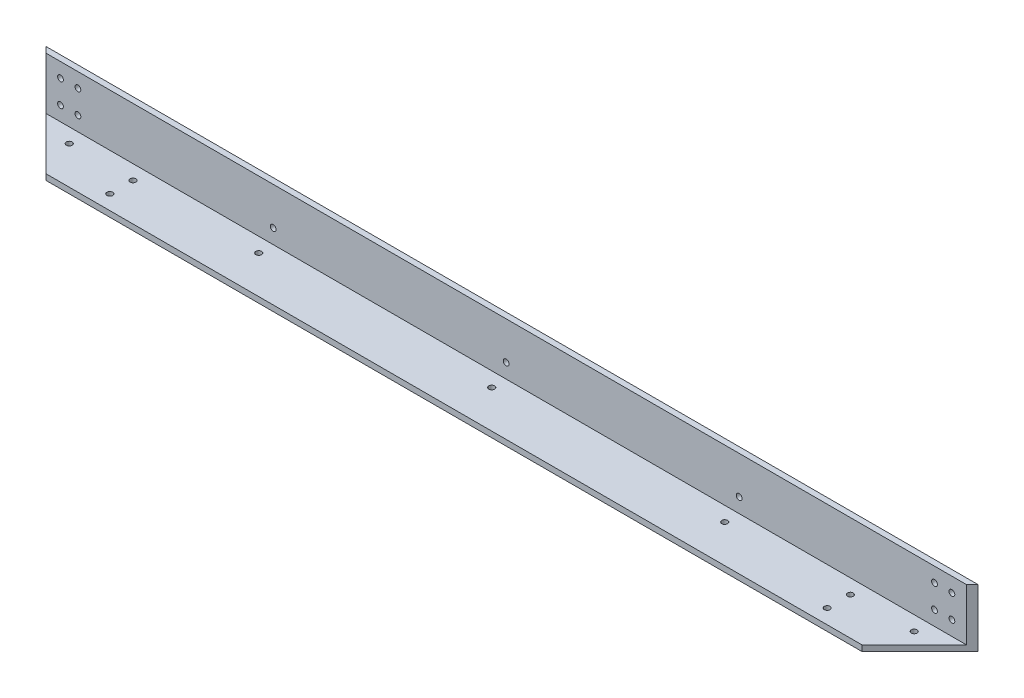
ISO-10303-21;
HEADER;
FILE_DESCRIPTION(('STEP AP214'),'2;1');
FILE_NAME('part.step','',(''),(''),'','','');
FILE_SCHEMA(('AUTOMOTIVE_DESIGN { 1 0 10303 214 1 1 1 1 }'));
ENDSEC;
DATA;
#1=APPLICATION_CONTEXT('core data for automotive mechanical design processes');
#2=APPLICATION_PROTOCOL_DEFINITION('international standard','automotive_design',2000,#1);
#3=PRODUCT_CONTEXT('',#1,'mechanical');
#4=PRODUCT('Part','Part','',(#3));
#5=PRODUCT_RELATED_PRODUCT_CATEGORY('part','',(#4));
#6=PRODUCT_DEFINITION_FORMATION('','',#4);
#7=PRODUCT_DEFINITION_CONTEXT('part definition',#1,'design');
#8=PRODUCT_DEFINITION('design','',#6,#7);
#9=PRODUCT_DEFINITION_SHAPE('','',#8);
#10=(LENGTH_UNIT() NAMED_UNIT(*) SI_UNIT(.MILLI.,.METRE.));
#11=(NAMED_UNIT(*) PLANE_ANGLE_UNIT() SI_UNIT($,.RADIAN.));
#12=(NAMED_UNIT(*) SI_UNIT($,.STERADIAN.) SOLID_ANGLE_UNIT());
#13=UNCERTAINTY_MEASURE_WITH_UNIT(LENGTH_MEASURE(1.E-05),#10,'distance_accuracy_value','');
#14=(GEOMETRIC_REPRESENTATION_CONTEXT(3) GLOBAL_UNCERTAINTY_ASSIGNED_CONTEXT((#13)) GLOBAL_UNIT_ASSIGNED_CONTEXT((#10,
#11,#12)) REPRESENTATION_CONTEXT('',''));
#15=CARTESIAN_POINT('',(0.,0.,0.));
#16=DIRECTION('',(0.,0.,1.));
#17=DIRECTION('',(1.,0.,0.));
#18=AXIS2_PLACEMENT_3D('',#15,#16,#17);
#19=CARTESIAN_POINT('',(510.,31.75,0.));
#20=DIRECTION('',(0.,0.,1.));
#21=DIRECTION('',(0.,-1.,0.));
#22=AXIS2_PLACEMENT_3D('',#19,#20,#21);
#23=PLANE('',#22);
#24=CARTESIAN_POINT('',(20.6375,11.1125,0.));
#25=DIRECTION('',(0.,0.,1.));
#26=DIRECTION('',(1.,0.,0.));
#27=AXIS2_PLACEMENT_3D('',#24,#25,#26);
#28=CIRCLE('',#27,1.5875);
#29=CARTESIAN_POINT('',(22.225,11.1125,0.));
#30=VERTEX_POINT('',#29);
#31=EDGE_CURVE('E307',#30,#30,#28,.T.);
#32=ORIENTED_EDGE('',*,*,#31,.T.);
#33=EDGE_LOOP('',(#32));
#34=FACE_BOUND('',#33,.T.);
#35=CARTESIAN_POINT('',(489.3625,11.1125,0.));
#36=DIRECTION('',(0.,0.,1.));
#37=DIRECTION('',(1.,0.,0.));
#38=AXIS2_PLACEMENT_3D('',#35,#36,#37);
#39=CIRCLE('',#38,1.58750000000004);
#40=CARTESIAN_POINT('',(490.95,11.1125,0.));
#41=VERTEX_POINT('',#40);
#42=EDGE_CURVE('E297',#41,#41,#39,.T.);
#43=ORIENTED_EDGE('',*,*,#42,.T.);
#44=EDGE_LOOP('',(#43));
#45=FACE_BOUND('',#44,.T.);
#46=CARTESIAN_POINT('',(498.8875,11.1125,0.));
#47=DIRECTION('',(0.,0.,1.));
#48=DIRECTION('',(1.,0.,0.));
#49=AXIS2_PLACEMENT_3D('',#46,#47,#48);
#50=CIRCLE('',#49,1.58749999999999);
#51=CARTESIAN_POINT('',(500.475,11.1125,0.));
#52=VERTEX_POINT('',#51);
#53=EDGE_CURVE('E298',#52,#52,#50,.T.);
#54=ORIENTED_EDGE('',*,*,#53,.T.);
#55=EDGE_LOOP('',(#54));
#56=FACE_BOUND('',#55,.T.);
#57=CARTESIAN_POINT('',(127.5,11.1125,0.));
#58=DIRECTION('',(0.,0.,1.));
#59=DIRECTION('',(1.,0.,0.));
#60=AXIS2_PLACEMENT_3D('',#57,#58,#59);
#61=CIRCLE('',#60,1.58749999999998);
#62=CARTESIAN_POINT('',(129.0875,11.1125,0.));
#63=VERTEX_POINT('',#62);
#64=EDGE_CURVE('E281',#63,#63,#61,.T.);
#65=ORIENTED_EDGE('',*,*,#64,.T.);
#66=EDGE_LOOP('',(#65));
#67=FACE_BOUND('',#66,.T.);
#68=CARTESIAN_POINT('',(11.1125,11.1125,0.));
#69=DIRECTION('',(0.,0.,1.));
#70=DIRECTION('',(1.,0.,0.));
#71=AXIS2_PLACEMENT_3D('',#68,#69,#70);
#72=CIRCLE('',#71,1.5875);
#73=CARTESIAN_POINT('',(12.7,11.1125,0.));
#74=VERTEX_POINT('',#73);
#75=EDGE_CURVE('E306',#74,#74,#72,.T.);
#76=ORIENTED_EDGE('',*,*,#75,.T.);
#77=EDGE_LOOP('',(#76));
#78=FACE_BOUND('',#77,.T.);
#79=CARTESIAN_POINT('',(20.6375,23.8125,0.));
#80=DIRECTION('',(0.,0.,1.));
#81=DIRECTION('',(1.,0.,0.));
#82=AXIS2_PLACEMENT_3D('',#79,#80,#81);
#83=CIRCLE('',#82,1.5875);
#84=CARTESIAN_POINT('',(22.225,23.8125,0.));
#85=VERTEX_POINT('',#84);
#86=EDGE_CURVE('E330',#85,#85,#83,.T.);
#87=ORIENTED_EDGE('',*,*,#86,.T.);
#88=EDGE_LOOP('',(#87));
#89=FACE_BOUND('',#88,.T.);
#90=CARTESIAN_POINT('',(489.3625,23.8125,0.));
#91=DIRECTION('',(0.,0.,1.));
#92=DIRECTION('',(1.,0.,0.));
#93=AXIS2_PLACEMENT_3D('',#90,#91,#92);
#94=CIRCLE('',#93,1.58750000000004);
#95=CARTESIAN_POINT('',(490.95,23.8125,0.));
#96=VERTEX_POINT('',#95);
#97=EDGE_CURVE('E324',#96,#96,#94,.T.);
#98=ORIENTED_EDGE('',*,*,#97,.T.);
#99=EDGE_LOOP('',(#98));
#100=FACE_BOUND('',#99,.T.);
#101=CARTESIAN_POINT('',(498.8875,23.8125,0.));
#102=DIRECTION('',(0.,0.,1.));
#103=DIRECTION('',(1.,0.,0.));
#104=AXIS2_PLACEMENT_3D('',#101,#102,#103);
#105=CIRCLE('',#104,1.58749999999999);
#106=CARTESIAN_POINT('',(500.475,23.8125,0.));
#107=VERTEX_POINT('',#106);
#108=EDGE_CURVE('E318',#107,#107,#105,.T.);
#109=ORIENTED_EDGE('',*,*,#108,.T.);
#110=EDGE_LOOP('',(#109));
#111=FACE_BOUND('',#110,.T.);
#112=CARTESIAN_POINT('',(255.,11.1125,0.));
#113=DIRECTION('',(0.,0.,1.));
#114=DIRECTION('',(1.,0.,0.));
#115=AXIS2_PLACEMENT_3D('',#112,#113,#114);
#116=CIRCLE('',#115,1.58750000000004);
#117=CARTESIAN_POINT('',(256.5875,11.1125,0.));
#118=VERTEX_POINT('',#117);
#119=EDGE_CURVE('E276',#118,#118,#116,.T.);
#120=ORIENTED_EDGE('',*,*,#119,.T.);
#121=EDGE_LOOP('',(#120));
#122=FACE_BOUND('',#121,.T.);
#123=CARTESIAN_POINT('',(382.5,11.1125,0.));
#124=DIRECTION('',(0.,0.,1.));
#125=DIRECTION('',(1.,0.,0.));
#126=AXIS2_PLACEMENT_3D('',#123,#124,#125);
#127=CIRCLE('',#126,1.58750000000004);
#128=CARTESIAN_POINT('',(384.0875,11.1125,0.));
#129=VERTEX_POINT('',#128);
#130=EDGE_CURVE('E291',#129,#129,#127,.T.);
#131=ORIENTED_EDGE('',*,*,#130,.T.);
#132=EDGE_LOOP('',(#131));
#133=FACE_BOUND('',#132,.T.);
#134=CARTESIAN_POINT('',(11.1125,23.8125,0.));
#135=DIRECTION('',(0.,0.,1.));
#136=DIRECTION('',(1.,0.,0.));
#137=AXIS2_PLACEMENT_3D('',#134,#135,#136);
#138=CIRCLE('',#137,1.5875);
#139=CARTESIAN_POINT('',(12.7,23.8125,0.));
#140=VERTEX_POINT('',#139);
#141=EDGE_CURVE('E338',#140,#140,#138,.T.);
#142=ORIENTED_EDGE('',*,*,#141,.T.);
#143=EDGE_LOOP('',(#142));
#144=FACE_BOUND('',#143,.T.);
#145=DIRECTION('',(0.,1.,0.));
#146=VECTOR('',#145,1.);
#147=CARTESIAN_POINT('',(0.,31.75,0.));
#148=LINE('',#147,#146);
#149=CARTESIAN_POINT('',(0.,0.,0.));
#150=VERTEX_POINT('',#149);
#151=CARTESIAN_POINT('',(0.,31.75,0.));
#152=VERTEX_POINT('',#151);
#153=EDGE_CURVE('E109',#150,#152,#148,.T.);
#154=ORIENTED_EDGE('',*,*,#153,.T.);
#155=DIRECTION('',(-1.,0.,0.));
#156=VECTOR('',#155,1.);
#157=CARTESIAN_POINT('',(510.,31.75,0.));
#158=LINE('',#157,#156);
#159=CARTESIAN_POINT('',(510.,31.75,0.));
#160=VERTEX_POINT('',#159);
#161=EDGE_CURVE('E95',#160,#152,#158,.T.);
#162=ORIENTED_EDGE('',*,*,#161,.F.);
#163=DIRECTION('',(0.,1.,0.));
#164=VECTOR('',#163,1.);
#165=CARTESIAN_POINT('',(510.,31.75,0.));
#166=LINE('',#165,#164);
#167=CARTESIAN_POINT('',(510.,0.,0.));
#168=VERTEX_POINT('',#167);
#169=EDGE_CURVE('E107',#168,#160,#166,.T.);
#170=ORIENTED_EDGE('',*,*,#169,.F.);
#171=DIRECTION('',(-1.,0.,0.));
#172=VECTOR('',#171,1.);
#173=CARTESIAN_POINT('',(510.,0.,0.));
#174=LINE('',#173,#172);
#175=EDGE_CURVE('E116',#168,#150,#174,.T.);
#176=ORIENTED_EDGE('',*,*,#175,.T.);
#177=EDGE_LOOP('',(#154,#162,#170,#176));
#178=FACE_BOUND('',#177,.T.);
#179=ADVANCED_FACE('F40',(#34,#45,#56,#67,#78,#89,#100,#111,#122,#133,#144,#178),#23,.F.);
#180=CARTESIAN_POINT('',(510.,31.75,3.17499999999997));
#181=DIRECTION('',(0.,-1.,0.));
#182=DIRECTION('',(0.,0.,-1.));
#183=AXIS2_PLACEMENT_3D('',#180,#181,#182);
#184=PLANE('',#183);
#185=ORIENTED_EDGE('',*,*,#161,.T.);
#186=DIRECTION('',(0.707106781186546,0.,0.707106781186549));
#187=VECTOR('',#186,1.);
#188=CARTESIAN_POINT('',(31.75,31.75,31.75));
#189=LINE('',#188,#187);
#190=CARTESIAN_POINT('',(3.17500000000004,31.75,3.17499999999997));
#191=VERTEX_POINT('',#190);
#192=EDGE_CURVE('E63',#152,#191,#189,.T.);
#193=ORIENTED_EDGE('',*,*,#192,.T.);
#194=DIRECTION('',(-1.,0.,0.));
#195=VECTOR('',#194,1.);
#196=CARTESIAN_POINT('',(510.,31.75,3.17499999999997));
#197=LINE('',#196,#195);
#198=CARTESIAN_POINT('',(506.825,31.75,3.17499999999997));
#199=VERTEX_POINT('',#198);
#200=EDGE_CURVE('E97',#199,#191,#197,.T.);
#201=ORIENTED_EDGE('',*,*,#200,.F.);
#202=DIRECTION('',(-0.707106781186548,0.,0.707106781186547));
#203=VECTOR('',#202,1.);
#204=CARTESIAN_POINT('',(510.,31.75,0.));
#205=LINE('',#204,#203);
#206=EDGE_CURVE('E92',#199,#160,#205,.F.);
#207=ORIENTED_EDGE('',*,*,#206,.T.);
#208=EDGE_LOOP('',(#185,#193,#201,#207));
#209=FACE_BOUND('',#208,.T.);
#210=ADVANCED_FACE('F94',(#209),#184,.F.);
#211=CARTESIAN_POINT('',(510.,3.17499999999996,3.175));
#212=DIRECTION('',(0.,0.,-1.));
#213=DIRECTION('',(0.,1.,0.));
#214=AXIS2_PLACEMENT_3D('',#211,#212,#213);
#215=PLANE('',#214);
#216=CARTESIAN_POINT('',(20.6375,11.1125,3.17500000000001));
#217=DIRECTION('',(0.,0.,1.));
#218=DIRECTION('',(1.,0.,0.));
#219=AXIS2_PLACEMENT_3D('',#216,#217,#218);
#220=CIRCLE('',#219,1.5875);
#221=CARTESIAN_POINT('',(22.225,11.1125,3.17500000000001));
#222=VERTEX_POINT('',#221);
#223=EDGE_CURVE('E303',#222,#222,#220,.T.);
#224=ORIENTED_EDGE('',*,*,#223,.F.);
#225=EDGE_LOOP('',(#224));
#226=FACE_BOUND('',#225,.T.);
#227=CARTESIAN_POINT('',(489.3625,11.1125,3.17500000000001));
#228=DIRECTION('',(0.,0.,1.));
#229=DIRECTION('',(1.,0.,0.));
#230=AXIS2_PLACEMENT_3D('',#227,#228,#229);
#231=CIRCLE('',#230,1.58750000000004);
#232=CARTESIAN_POINT('',(490.95,11.1125,3.17500000000001));
#233=VERTEX_POINT('',#232);
#234=EDGE_CURVE('E309',#233,#233,#231,.T.);
#235=ORIENTED_EDGE('',*,*,#234,.F.);
#236=EDGE_LOOP('',(#235));
#237=FACE_BOUND('',#236,.T.);
#238=CARTESIAN_POINT('',(498.8875,11.1125,3.17500000000001));
#239=DIRECTION('',(0.,0.,1.));
#240=DIRECTION('',(1.,0.,0.));
#241=AXIS2_PLACEMENT_3D('',#238,#239,#240);
#242=CIRCLE('',#241,1.58749999999999);
#243=CARTESIAN_POINT('',(500.475,11.1125,3.17500000000001));
#244=VERTEX_POINT('',#243);
#245=EDGE_CURVE('E294',#244,#244,#242,.T.);
#246=ORIENTED_EDGE('',*,*,#245,.F.);
#247=EDGE_LOOP('',(#246));
#248=FACE_BOUND('',#247,.T.);
#249=CARTESIAN_POINT('',(127.5,11.1125,3.17500000000001));
#250=DIRECTION('',(0.,0.,1.));
#251=DIRECTION('',(1.,0.,0.));
#252=AXIS2_PLACEMENT_3D('',#249,#250,#251);
#253=CIRCLE('',#252,1.58749999999998);
#254=CARTESIAN_POINT('',(129.0875,11.1125,3.17500000000001));
#255=VERTEX_POINT('',#254);
#256=EDGE_CURVE('E284',#255,#255,#253,.T.);
#257=ORIENTED_EDGE('',*,*,#256,.F.);
#258=EDGE_LOOP('',(#257));
#259=FACE_BOUND('',#258,.T.);
#260=CARTESIAN_POINT('',(11.1125,11.1125,3.17500000000001));
#261=DIRECTION('',(0.,0.,1.));
#262=DIRECTION('',(1.,0.,0.));
#263=AXIS2_PLACEMENT_3D('',#260,#261,#262);
#264=CIRCLE('',#263,1.5875);
#265=CARTESIAN_POINT('',(12.7,11.1125,3.17500000000001));
#266=VERTEX_POINT('',#265);
#267=EDGE_CURVE('E333',#266,#266,#264,.T.);
#268=ORIENTED_EDGE('',*,*,#267,.F.);
#269=EDGE_LOOP('',(#268));
#270=FACE_BOUND('',#269,.T.);
#271=CARTESIAN_POINT('',(20.6375,23.8125,3.17500000000001));
#272=DIRECTION('',(0.,0.,1.));
#273=DIRECTION('',(1.,0.,0.));
#274=AXIS2_PLACEMENT_3D('',#271,#272,#273);
#275=CIRCLE('',#274,1.5875);
#276=CARTESIAN_POINT('',(22.225,23.8125,3.17500000000001));
#277=VERTEX_POINT('',#276);
#278=EDGE_CURVE('E327',#277,#277,#275,.T.);
#279=ORIENTED_EDGE('',*,*,#278,.F.);
#280=EDGE_LOOP('',(#279));
#281=FACE_BOUND('',#280,.T.);
#282=CARTESIAN_POINT('',(489.3625,23.8125,3.17500000000001));
#283=DIRECTION('',(0.,0.,1.));
#284=DIRECTION('',(1.,0.,0.));
#285=AXIS2_PLACEMENT_3D('',#282,#283,#284);
#286=CIRCLE('',#285,1.58750000000004);
#287=CARTESIAN_POINT('',(490.95,23.8125,3.17500000000001));
#288=VERTEX_POINT('',#287);
#289=EDGE_CURVE('E321',#288,#288,#286,.T.);
#290=ORIENTED_EDGE('',*,*,#289,.F.);
#291=EDGE_LOOP('',(#290));
#292=FACE_BOUND('',#291,.T.);
#293=CARTESIAN_POINT('',(498.8875,23.8125,3.17500000000001));
#294=DIRECTION('',(0.,0.,1.));
#295=DIRECTION('',(1.,0.,0.));
#296=AXIS2_PLACEMENT_3D('',#293,#294,#295);
#297=CIRCLE('',#296,1.58749999999999);
#298=CARTESIAN_POINT('',(500.475,23.8125,3.17500000000001));
#299=VERTEX_POINT('',#298);
#300=EDGE_CURVE('E314',#299,#299,#297,.T.);
#301=ORIENTED_EDGE('',*,*,#300,.F.);
#302=EDGE_LOOP('',(#301));
#303=FACE_BOUND('',#302,.T.);
#304=CARTESIAN_POINT('',(255.,11.1125,3.17500000000001));
#305=DIRECTION('',(0.,0.,1.));
#306=DIRECTION('',(1.,0.,0.));
#307=AXIS2_PLACEMENT_3D('',#304,#305,#306);
#308=CIRCLE('',#307,1.58750000000004);
#309=CARTESIAN_POINT('',(256.5875,11.1125,3.17500000000001));
#310=VERTEX_POINT('',#309);
#311=EDGE_CURVE('E279',#310,#310,#308,.T.);
#312=ORIENTED_EDGE('',*,*,#311,.F.);
#313=EDGE_LOOP('',(#312));
#314=FACE_BOUND('',#313,.T.);
#315=CARTESIAN_POINT('',(382.5,11.1125,3.17500000000001));
#316=DIRECTION('',(0.,0.,1.));
#317=DIRECTION('',(1.,0.,0.));
#318=AXIS2_PLACEMENT_3D('',#315,#316,#317);
#319=CIRCLE('',#318,1.58750000000004);
#320=CARTESIAN_POINT('',(384.0875,11.1125,3.17500000000001));
#321=VERTEX_POINT('',#320);
#322=EDGE_CURVE('E286',#321,#321,#319,.T.);
#323=ORIENTED_EDGE('',*,*,#322,.F.);
#324=EDGE_LOOP('',(#323));
#325=FACE_BOUND('',#324,.T.);
#326=CARTESIAN_POINT('',(11.1125,23.8125,3.17500000000001));
#327=DIRECTION('',(0.,0.,1.));
#328=DIRECTION('',(1.,0.,0.));
#329=AXIS2_PLACEMENT_3D('',#326,#327,#328);
#330=CIRCLE('',#329,1.5875);
#331=CARTESIAN_POINT('',(12.7,23.8125,3.17500000000001));
#332=VERTEX_POINT('',#331);
#333=EDGE_CURVE('E317',#332,#332,#330,.T.);
#334=ORIENTED_EDGE('',*,*,#333,.F.);
#335=EDGE_LOOP('',(#334));
#336=FACE_BOUND('',#335,.T.);
#337=ORIENTED_EDGE('',*,*,#200,.T.);
#338=DIRECTION('',(0.,-1.,0.));
#339=VECTOR('',#338,1.);
#340=CARTESIAN_POINT('',(3.17500000000014,0.,3.17500000000001));
#341=LINE('',#340,#339);
#342=CARTESIAN_POINT('',(3.17500000000004,3.17499999999996,3.175));
#343=VERTEX_POINT('',#342);
#344=EDGE_CURVE('E49',#191,#343,#341,.T.);
#345=ORIENTED_EDGE('',*,*,#344,.T.);
#346=DIRECTION('',(-1.,0.,0.));
#347=VECTOR('',#346,1.);
#348=CARTESIAN_POINT('',(510.,3.17499999999996,3.175));
#349=LINE('',#348,#347);
#350=CARTESIAN_POINT('',(506.825,3.17499999999996,3.175));
#351=VERTEX_POINT('',#350);
#352=EDGE_CURVE('E131',#351,#343,#349,.T.);
#353=ORIENTED_EDGE('',*,*,#352,.F.);
#354=DIRECTION('',(0.,-1.,0.));
#355=VECTOR('',#354,1.);
#356=CARTESIAN_POINT('',(506.825,0.,3.17500000000001));
#357=LINE('',#356,#355);
#358=EDGE_CURVE('E102',#351,#199,#357,.F.);
#359=ORIENTED_EDGE('',*,*,#358,.T.);
#360=EDGE_LOOP('',(#337,#345,#353,#359));
#361=FACE_BOUND('',#360,.T.);
#362=ADVANCED_FACE('F155',(#226,#237,#248,#259,#270,#281,#292,#303,#314,#325,#336,#361),#215,.F.);
#363=CARTESIAN_POINT('',(510.,3.17499999999996,31.75));
#364=DIRECTION('',(0.,-1.,0.));
#365=DIRECTION('',(0.,0.,-1.));
#366=AXIS2_PLACEMENT_3D('',#363,#364,#365);
#367=PLANE('',#366);
#368=CARTESIAN_POINT('',(255.,3.17499999999996,11.1125));
#369=DIRECTION('',(0.,1.,0.));
#370=DIRECTION('',(0.,0.,1.));
#371=AXIS2_PLACEMENT_3D('',#368,#369,#370);
#372=CIRCLE('',#371,1.58750000000004);
#373=CARTESIAN_POINT('',(255.,3.17499999999996,12.7));
#374=VERTEX_POINT('',#373);
#375=EDGE_CURVE('E368',#374,#374,#372,.T.);
#376=ORIENTED_EDGE('',*,*,#375,.F.);
#377=EDGE_LOOP('',(#376));
#378=FACE_BOUND('',#377,.T.);
#379=CARTESIAN_POINT('',(382.5,3.17499999999996,11.1125));
#380=DIRECTION('',(0.,1.,0.));
#381=DIRECTION('',(0.,0.,1.));
#382=AXIS2_PLACEMENT_3D('',#379,#380,#381);
#383=CIRCLE('',#382,1.58750000000004);
#384=CARTESIAN_POINT('',(382.5,3.17499999999996,12.7));
#385=VERTEX_POINT('',#384);
#386=EDGE_CURVE('E373',#385,#385,#383,.T.);
#387=ORIENTED_EDGE('',*,*,#386,.F.);
#388=EDGE_LOOP('',(#387));
#389=FACE_BOUND('',#388,.T.);
#390=CARTESIAN_POINT('',(451.2625,3.17499999999996,23.8125));
#391=DIRECTION('',(0.,1.,0.));
#392=DIRECTION('',(0.,0.,1.));
#393=AXIS2_PLACEMENT_3D('',#390,#391,#392);
#394=CIRCLE('',#393,1.58750000000004);
#395=CARTESIAN_POINT('',(451.2625,3.17499999999996,25.4));
#396=VERTEX_POINT('',#395);
#397=EDGE_CURVE('E379',#396,#396,#394,.T.);
#398=ORIENTED_EDGE('',*,*,#397,.F.);
#399=EDGE_LOOP('',(#398));
#400=FACE_BOUND('',#399,.T.);
#401=CARTESIAN_POINT('',(451.2625,3.17499999999996,11.1125));
#402=DIRECTION('',(0.,1.,0.));
#403=DIRECTION('',(0.,0.,1.));
#404=AXIS2_PLACEMENT_3D('',#401,#402,#403);
#405=CIRCLE('',#404,1.58750000000004);
#406=CARTESIAN_POINT('',(451.2625,3.17499999999996,12.7));
#407=VERTEX_POINT('',#406);
#408=EDGE_CURVE('E385',#407,#407,#405,.T.);
#409=ORIENTED_EDGE('',*,*,#408,.F.);
#410=EDGE_LOOP('',(#409));
#411=FACE_BOUND('',#410,.T.);
#412=CARTESIAN_POINT('',(23.8125,3.17499999999996,11.1125));
#413=DIRECTION('',(0.,1.,0.));
#414=DIRECTION('',(0.,0.,1.));
#415=AXIS2_PLACEMENT_3D('',#412,#413,#414);
#416=CIRCLE('',#415,1.5875);
#417=CARTESIAN_POINT('',(23.8125,3.17499999999996,12.7));
#418=VERTEX_POINT('',#417);
#419=EDGE_CURVE('E351',#418,#418,#416,.T.);
#420=ORIENTED_EDGE('',*,*,#419,.F.);
#421=EDGE_LOOP('',(#420));
#422=FACE_BOUND('',#421,.T.);
#423=CARTESIAN_POINT('',(486.1875,3.17499999999996,11.1125));
#424=DIRECTION('',(0.,1.,0.));
#425=DIRECTION('',(0.,0.,1.));
#426=AXIS2_PLACEMENT_3D('',#423,#424,#425);
#427=CIRCLE('',#426,1.58750000000004);
#428=CARTESIAN_POINT('',(486.1875,3.17499999999996,12.7));
#429=VERTEX_POINT('',#428);
#430=EDGE_CURVE('E344',#429,#429,#427,.T.);
#431=ORIENTED_EDGE('',*,*,#430,.F.);
#432=EDGE_LOOP('',(#431));
#433=FACE_BOUND('',#432,.T.);
#434=CARTESIAN_POINT('',(58.7375,3.17499999999996,11.1125));
#435=DIRECTION('',(0.,1.,0.));
#436=DIRECTION('',(0.,0.,1.));
#437=AXIS2_PLACEMENT_3D('',#434,#435,#436);
#438=CIRCLE('',#437,1.5875);
#439=CARTESIAN_POINT('',(58.7375,3.17499999999996,12.7));
#440=VERTEX_POINT('',#439);
#441=EDGE_CURVE('E363',#440,#440,#438,.T.);
#442=ORIENTED_EDGE('',*,*,#441,.F.);
#443=EDGE_LOOP('',(#442));
#444=FACE_BOUND('',#443,.T.);
#445=CARTESIAN_POINT('',(58.7375,3.17499999999996,23.8125));
#446=DIRECTION('',(0.,1.,0.));
#447=DIRECTION('',(0.,0.,1.));
#448=AXIS2_PLACEMENT_3D('',#445,#446,#447);
#449=CIRCLE('',#448,1.58749999999998);
#450=CARTESIAN_POINT('',(58.7375,3.17499999999996,25.3999999999999));
#451=VERTEX_POINT('',#450);
#452=EDGE_CURVE('E356',#451,#451,#449,.T.);
#453=ORIENTED_EDGE('',*,*,#452,.F.);
#454=EDGE_LOOP('',(#453));
#455=FACE_BOUND('',#454,.T.);
#456=CARTESIAN_POINT('',(127.5,3.17499999999996,11.1125));
#457=DIRECTION('',(0.,1.,0.));
#458=DIRECTION('',(0.,0.,1.));
#459=AXIS2_PLACEMENT_3D('',#456,#457,#458);
#460=CIRCLE('',#459,1.58749999999998);
#461=CARTESIAN_POINT('',(127.5,3.17499999999996,12.7));
#462=VERTEX_POINT('',#461);
#463=EDGE_CURVE('E123',#462,#462,#460,.T.);
#464=ORIENTED_EDGE('',*,*,#463,.F.);
#465=EDGE_LOOP('',(#464));
#466=FACE_BOUND('',#465,.T.);
#467=ORIENTED_EDGE('',*,*,#352,.T.);
#468=DIRECTION('',(0.707106781186546,0.,0.707106781186549));
#469=VECTOR('',#468,1.);
#470=CARTESIAN_POINT('',(31.75,3.17499999999996,31.75));
#471=LINE('',#470,#469);
#472=CARTESIAN_POINT('',(31.75,3.17499999999996,31.75));
#473=VERTEX_POINT('',#472);
#474=EDGE_CURVE('E11',#343,#473,#471,.T.);
#475=ORIENTED_EDGE('',*,*,#474,.T.);
#476=DIRECTION('',(-1.,0.,0.));
#477=VECTOR('',#476,1.);
#478=CARTESIAN_POINT('',(510.,3.17499999999996,31.75));
#479=LINE('',#478,#477);
#480=CARTESIAN_POINT('',(478.25,3.17499999999996,31.75));
#481=VERTEX_POINT('',#480);
#482=EDGE_CURVE('E128',#481,#473,#479,.T.);
#483=ORIENTED_EDGE('',*,*,#482,.F.);
#484=DIRECTION('',(-0.707106781186548,0.,0.707106781186547));
#485=VECTOR('',#484,1.);
#486=CARTESIAN_POINT('',(510.,3.17499999999996,0.));
#487=LINE('',#486,#485);
#488=EDGE_CURVE('E137',#481,#351,#487,.F.);
#489=ORIENTED_EDGE('',*,*,#488,.T.);
#490=EDGE_LOOP('',(#467,#475,#483,#489));
#491=FACE_BOUND('',#490,.T.);
#492=ADVANCED_FACE('F152',(#378,#389,#400,#411,#422,#433,#444,#455,#466,#491),#367,.F.);
#493=CARTESIAN_POINT('',(510.,0.,31.75));
#494=DIRECTION('',(0.,0.,-1.));
#495=DIRECTION('',(-1.,0.,0.));
#496=AXIS2_PLACEMENT_3D('',#493,#494,#495);
#497=PLANE('',#496);
#498=ORIENTED_EDGE('',*,*,#482,.T.);
#499=DIRECTION('',(0.,-1.,0.));
#500=VECTOR('',#499,1.);
#501=CARTESIAN_POINT('',(31.75,0.,31.75));
#502=LINE('',#501,#500);
#503=CARTESIAN_POINT('',(31.75,0.,31.75));
#504=VERTEX_POINT('',#503);
#505=EDGE_CURVE('E101',#473,#504,#502,.T.);
#506=ORIENTED_EDGE('',*,*,#505,.T.);
#507=DIRECTION('',(-1.,0.,0.));
#508=VECTOR('',#507,1.);
#509=CARTESIAN_POINT('',(510.,0.,31.75));
#510=LINE('',#509,#508);
#511=CARTESIAN_POINT('',(478.25,0.,31.75));
#512=VERTEX_POINT('',#511);
#513=EDGE_CURVE('E118',#512,#504,#510,.T.);
#514=ORIENTED_EDGE('',*,*,#513,.F.);
#515=DIRECTION('',(0.,1.,0.));
#516=VECTOR('',#515,1.);
#517=CARTESIAN_POINT('',(478.25,0.,31.75));
#518=LINE('',#517,#516);
#519=EDGE_CURVE('E135',#512,#481,#518,.T.);
#520=ORIENTED_EDGE('',*,*,#519,.T.);
#521=EDGE_LOOP('',(#498,#506,#514,#520));
#522=FACE_BOUND('',#521,.T.);
#523=ADVANCED_FACE('F154',(#522),#497,.F.);
#524=CARTESIAN_POINT('',(510.,0.,0.));
#525=DIRECTION('',(0.,1.,0.));
#526=DIRECTION('',(0.,0.,1.));
#527=AXIS2_PLACEMENT_3D('',#524,#525,#526);
#528=PLANE('',#527);
#529=CARTESIAN_POINT('',(255.,0.,11.1125));
#530=DIRECTION('',(0.,1.,0.));
#531=DIRECTION('',(0.,0.,1.));
#532=AXIS2_PLACEMENT_3D('',#529,#530,#531);
#533=CIRCLE('',#532,1.58750000000004);
#534=CARTESIAN_POINT('',(255.,0.,12.7));
#535=VERTEX_POINT('',#534);
#536=EDGE_CURVE('E371',#535,#535,#533,.T.);
#537=ORIENTED_EDGE('',*,*,#536,.T.);
#538=EDGE_LOOP('',(#537));
#539=FACE_BOUND('',#538,.T.);
#540=CARTESIAN_POINT('',(382.5,0.,11.1125));
#541=DIRECTION('',(0.,1.,0.));
#542=DIRECTION('',(0.,0.,1.));
#543=AXIS2_PLACEMENT_3D('',#540,#541,#542);
#544=CIRCLE('',#543,1.58750000000004);
#545=CARTESIAN_POINT('',(382.5,0.,12.7));
#546=VERTEX_POINT('',#545);
#547=EDGE_CURVE('E376',#546,#546,#544,.T.);
#548=ORIENTED_EDGE('',*,*,#547,.T.);
#549=EDGE_LOOP('',(#548));
#550=FACE_BOUND('',#549,.T.);
#551=CARTESIAN_POINT('',(451.2625,0.,23.8125));
#552=DIRECTION('',(0.,1.,0.));
#553=DIRECTION('',(0.,0.,1.));
#554=AXIS2_PLACEMENT_3D('',#551,#552,#553);
#555=CIRCLE('',#554,1.58750000000004);
#556=CARTESIAN_POINT('',(451.2625,0.,25.4));
#557=VERTEX_POINT('',#556);
#558=EDGE_CURVE('E382',#557,#557,#555,.T.);
#559=ORIENTED_EDGE('',*,*,#558,.T.);
#560=EDGE_LOOP('',(#559));
#561=FACE_BOUND('',#560,.T.);
#562=CARTESIAN_POINT('',(451.2625,0.,11.1125));
#563=DIRECTION('',(0.,1.,0.));
#564=DIRECTION('',(0.,0.,1.));
#565=AXIS2_PLACEMENT_3D('',#562,#563,#564);
#566=CIRCLE('',#565,1.58750000000004);
#567=CARTESIAN_POINT('',(451.2625,0.,12.7));
#568=VERTEX_POINT('',#567);
#569=EDGE_CURVE('E359',#568,#568,#566,.T.);
#570=ORIENTED_EDGE('',*,*,#569,.T.);
#571=EDGE_LOOP('',(#570));
#572=FACE_BOUND('',#571,.T.);
#573=CARTESIAN_POINT('',(23.8125,0.,11.1125));
#574=DIRECTION('',(0.,1.,0.));
#575=DIRECTION('',(0.,0.,1.));
#576=AXIS2_PLACEMENT_3D('',#573,#574,#575);
#577=CIRCLE('',#576,1.5875);
#578=CARTESIAN_POINT('',(23.8125,0.,12.7));
#579=VERTEX_POINT('',#578);
#580=EDGE_CURVE('E341',#579,#579,#577,.T.);
#581=ORIENTED_EDGE('',*,*,#580,.T.);
#582=EDGE_LOOP('',(#581));
#583=FACE_BOUND('',#582,.T.);
#584=CARTESIAN_POINT('',(486.1875,0.,11.1125));
#585=DIRECTION('',(0.,1.,0.));
#586=DIRECTION('',(0.,0.,1.));
#587=AXIS2_PLACEMENT_3D('',#584,#585,#586);
#588=CIRCLE('',#587,1.58750000000004);
#589=CARTESIAN_POINT('',(486.1875,0.,12.7));
#590=VERTEX_POINT('',#589);
#591=EDGE_CURVE('E348',#590,#590,#588,.T.);
#592=ORIENTED_EDGE('',*,*,#591,.T.);
#593=EDGE_LOOP('',(#592));
#594=FACE_BOUND('',#593,.T.);
#595=CARTESIAN_POINT('',(58.7375,0.,11.1125));
#596=DIRECTION('',(0.,1.,0.));
#597=DIRECTION('',(0.,0.,1.));
#598=AXIS2_PLACEMENT_3D('',#595,#596,#597);
#599=CIRCLE('',#598,1.5875);
#600=CARTESIAN_POINT('',(58.7375,0.,12.7));
#601=VERTEX_POINT('',#600);
#602=EDGE_CURVE('E347',#601,#601,#599,.T.);
#603=ORIENTED_EDGE('',*,*,#602,.T.);
#604=EDGE_LOOP('',(#603));
#605=FACE_BOUND('',#604,.T.);
#606=CARTESIAN_POINT('',(58.7375,0.,23.8125));
#607=DIRECTION('',(0.,1.,0.));
#608=DIRECTION('',(0.,0.,1.));
#609=AXIS2_PLACEMENT_3D('',#606,#607,#608);
#610=CIRCLE('',#609,1.58749999999998);
#611=CARTESIAN_POINT('',(58.7375,0.,25.3999999999999));
#612=VERTEX_POINT('',#611);
#613=EDGE_CURVE('E360',#612,#612,#610,.T.);
#614=ORIENTED_EDGE('',*,*,#613,.T.);
#615=EDGE_LOOP('',(#614));
#616=FACE_BOUND('',#615,.T.);
#617=CARTESIAN_POINT('',(127.5,0.,11.1125));
#618=DIRECTION('',(0.,1.,0.));
#619=DIRECTION('',(0.,0.,1.));
#620=AXIS2_PLACEMENT_3D('',#617,#618,#619);
#621=CIRCLE('',#620,1.58749999999998);
#622=CARTESIAN_POINT('',(127.5,0.,12.7));
#623=VERTEX_POINT('',#622);
#624=EDGE_CURVE('E120',#623,#623,#621,.T.);
#625=ORIENTED_EDGE('',*,*,#624,.T.);
#626=EDGE_LOOP('',(#625));
#627=FACE_BOUND('',#626,.T.);
#628=ORIENTED_EDGE('',*,*,#513,.T.);
#629=DIRECTION('',(-0.707106781186546,0.,-0.707106781186549));
#630=VECTOR('',#629,1.);
#631=CARTESIAN_POINT('',(31.75,0.,31.75));
#632=LINE('',#631,#630);
#633=EDGE_CURVE('E142',#504,#150,#632,.T.);
#634=ORIENTED_EDGE('',*,*,#633,.T.);
#635=ORIENTED_EDGE('',*,*,#175,.F.);
#636=DIRECTION('',(0.707106781186548,0.,-0.707106781186547));
#637=VECTOR('',#636,1.);
#638=CARTESIAN_POINT('',(510.,0.,0.));
#639=LINE('',#638,#637);
#640=EDGE_CURVE('E110',#168,#512,#639,.F.);
#641=ORIENTED_EDGE('',*,*,#640,.T.);
#642=EDGE_LOOP('',(#628,#634,#635,#641));
#643=FACE_BOUND('',#642,.T.);
#644=ADVANCED_FACE('F145',(#539,#550,#561,#572,#583,#594,#605,#616,#627,#643),#528,.F.);
#645=CARTESIAN_POINT('',(510.,0.,0.));
#646=DIRECTION('',(-0.707106781186547,0.,-0.707106781186548));
#647=DIRECTION('',(0.,-1.,0.));
#648=AXIS2_PLACEMENT_3D('',#645,#646,#647);
#649=PLANE('',#648);
#650=ORIENTED_EDGE('',*,*,#488,.F.);
#651=ORIENTED_EDGE('',*,*,#519,.F.);
#652=ORIENTED_EDGE('',*,*,#640,.F.);
#653=ORIENTED_EDGE('',*,*,#169,.T.);
#654=ORIENTED_EDGE('',*,*,#206,.F.);
#655=ORIENTED_EDGE('',*,*,#358,.F.);
#656=EDGE_LOOP('',(#650,#651,#652,#653,#654,#655));
#657=FACE_BOUND('',#656,.T.);
#658=ADVANCED_FACE('F113',(#657),#649,.F.);
#659=CARTESIAN_POINT('',(31.75,0.,31.75));
#660=DIRECTION('',(-0.707106781186549,0.,0.707106781186546));
#661=DIRECTION('',(0.,1.,0.));
#662=AXIS2_PLACEMENT_3D('',#659,#660,#661);
#663=PLANE('',#662);
#664=ORIENTED_EDGE('',*,*,#192,.F.);
#665=ORIENTED_EDGE('',*,*,#153,.F.);
#666=ORIENTED_EDGE('',*,*,#633,.F.);
#667=ORIENTED_EDGE('',*,*,#505,.F.);
#668=ORIENTED_EDGE('',*,*,#474,.F.);
#669=ORIENTED_EDGE('',*,*,#344,.F.);
#670=EDGE_LOOP('',(#664,#665,#666,#667,#668,#669));
#671=FACE_BOUND('',#670,.T.);
#672=ADVANCED_FACE('F43',(#671),#663,.T.);
#673=CARTESIAN_POINT('',(127.5,0.,11.1125));
#674=DIRECTION('',(0.,1.,0.));
#675=DIRECTION('',(0.,0.,1.));
#676=AXIS2_PLACEMENT_3D('',#673,#674,#675);
#677=CYLINDRICAL_SURFACE('',#676,1.58749999999998);
#678=ORIENTED_EDGE('',*,*,#624,.F.);
#679=EDGE_LOOP('',(#678));
#680=FACE_BOUND('',#679,.T.);
#681=ORIENTED_EDGE('',*,*,#463,.T.);
#682=EDGE_LOOP('',(#681));
#683=FACE_BOUND('',#682,.T.);
#684=ADVANCED_FACE('F183',(#680,#683),#677,.F.);
#685=CARTESIAN_POINT('',(58.7375,0.,23.8125));
#686=DIRECTION('',(0.,1.,0.));
#687=DIRECTION('',(0.,0.,1.));
#688=AXIS2_PLACEMENT_3D('',#685,#686,#687);
#689=CYLINDRICAL_SURFACE('',#688,1.58749999999998);
#690=ORIENTED_EDGE('',*,*,#613,.F.);
#691=EDGE_LOOP('',(#690));
#692=FACE_BOUND('',#691,.T.);
#693=ORIENTED_EDGE('',*,*,#452,.T.);
#694=EDGE_LOOP('',(#693));
#695=FACE_BOUND('',#694,.T.);
#696=ADVANCED_FACE('F195',(#692,#695),#689,.F.);
#697=CARTESIAN_POINT('',(58.7375,0.,11.1125));
#698=DIRECTION('',(0.,1.,0.));
#699=DIRECTION('',(0.,0.,1.));
#700=AXIS2_PLACEMENT_3D('',#697,#698,#699);
#701=CYLINDRICAL_SURFACE('',#700,1.5875);
#702=ORIENTED_EDGE('',*,*,#602,.F.);
#703=EDGE_LOOP('',(#702));
#704=FACE_BOUND('',#703,.T.);
#705=ORIENTED_EDGE('',*,*,#441,.T.);
#706=EDGE_LOOP('',(#705));
#707=FACE_BOUND('',#706,.T.);
#708=ADVANCED_FACE('F215',(#704,#707),#701,.F.);
#709=CARTESIAN_POINT('',(486.1875,0.,11.1125));
#710=DIRECTION('',(0.,1.,0.));
#711=DIRECTION('',(0.,0.,1.));
#712=AXIS2_PLACEMENT_3D('',#709,#710,#711);
#713=CYLINDRICAL_SURFACE('',#712,1.58750000000004);
#714=ORIENTED_EDGE('',*,*,#591,.F.);
#715=EDGE_LOOP('',(#714));
#716=FACE_BOUND('',#715,.T.);
#717=ORIENTED_EDGE('',*,*,#430,.T.);
#718=EDGE_LOOP('',(#717));
#719=FACE_BOUND('',#718,.T.);
#720=ADVANCED_FACE('F218',(#716,#719),#713,.F.);
#721=CARTESIAN_POINT('',(23.8125,0.,11.1125));
#722=DIRECTION('',(0.,1.,0.));
#723=DIRECTION('',(0.,0.,1.));
#724=AXIS2_PLACEMENT_3D('',#721,#722,#723);
#725=CYLINDRICAL_SURFACE('',#724,1.5875);
#726=ORIENTED_EDGE('',*,*,#580,.F.);
#727=EDGE_LOOP('',(#726));
#728=FACE_BOUND('',#727,.T.);
#729=ORIENTED_EDGE('',*,*,#419,.T.);
#730=EDGE_LOOP('',(#729));
#731=FACE_BOUND('',#730,.T.);
#732=ADVANCED_FACE('F201',(#728,#731),#725,.F.);
#733=CARTESIAN_POINT('',(451.2625,0.,11.1125));
#734=DIRECTION('',(0.,1.,0.));
#735=DIRECTION('',(0.,0.,1.));
#736=AXIS2_PLACEMENT_3D('',#733,#734,#735);
#737=CYLINDRICAL_SURFACE('',#736,1.58750000000004);
#738=ORIENTED_EDGE('',*,*,#569,.F.);
#739=EDGE_LOOP('',(#738));
#740=FACE_BOUND('',#739,.T.);
#741=ORIENTED_EDGE('',*,*,#408,.T.);
#742=EDGE_LOOP('',(#741));
#743=FACE_BOUND('',#742,.T.);
#744=ADVANCED_FACE('F197',(#740,#743),#737,.F.);
#745=CARTESIAN_POINT('',(451.2625,0.,23.8125));
#746=DIRECTION('',(0.,1.,0.));
#747=DIRECTION('',(0.,0.,1.));
#748=AXIS2_PLACEMENT_3D('',#745,#746,#747);
#749=CYLINDRICAL_SURFACE('',#748,1.58750000000004);
#750=ORIENTED_EDGE('',*,*,#558,.F.);
#751=EDGE_LOOP('',(#750));
#752=FACE_BOUND('',#751,.T.);
#753=ORIENTED_EDGE('',*,*,#397,.T.);
#754=EDGE_LOOP('',(#753));
#755=FACE_BOUND('',#754,.T.);
#756=ADVANCED_FACE('F200',(#752,#755),#749,.F.);
#757=CARTESIAN_POINT('',(382.5,0.,11.1125));
#758=DIRECTION('',(0.,1.,0.));
#759=DIRECTION('',(0.,0.,1.));
#760=AXIS2_PLACEMENT_3D('',#757,#758,#759);
#761=CYLINDRICAL_SURFACE('',#760,1.58750000000004);
#762=ORIENTED_EDGE('',*,*,#547,.F.);
#763=EDGE_LOOP('',(#762));
#764=FACE_BOUND('',#763,.T.);
#765=ORIENTED_EDGE('',*,*,#386,.T.);
#766=EDGE_LOOP('',(#765));
#767=FACE_BOUND('',#766,.T.);
#768=ADVANCED_FACE('F205',(#764,#767),#761,.F.);
#769=CARTESIAN_POINT('',(255.,0.,11.1125));
#770=DIRECTION('',(0.,1.,0.));
#771=DIRECTION('',(0.,0.,1.));
#772=AXIS2_PLACEMENT_3D('',#769,#770,#771);
#773=CYLINDRICAL_SURFACE('',#772,1.58750000000004);
#774=ORIENTED_EDGE('',*,*,#536,.F.);
#775=EDGE_LOOP('',(#774));
#776=FACE_BOUND('',#775,.T.);
#777=ORIENTED_EDGE('',*,*,#375,.T.);
#778=EDGE_LOOP('',(#777));
#779=FACE_BOUND('',#778,.T.);
#780=ADVANCED_FACE('F209',(#776,#779),#773,.F.);
#781=CARTESIAN_POINT('',(11.1125,23.8125,0.));
#782=DIRECTION('',(0.,0.,1.));
#783=DIRECTION('',(1.,0.,0.));
#784=AXIS2_PLACEMENT_3D('',#781,#782,#783);
#785=CYLINDRICAL_SURFACE('',#784,1.5875);
#786=ORIENTED_EDGE('',*,*,#141,.F.);
#787=EDGE_LOOP('',(#786));
#788=FACE_BOUND('',#787,.T.);
#789=ORIENTED_EDGE('',*,*,#333,.T.);
#790=EDGE_LOOP('',(#789));
#791=FACE_BOUND('',#790,.T.);
#792=ADVANCED_FACE('F213',(#788,#791),#785,.F.);
#793=CARTESIAN_POINT('',(382.5,11.1125,0.));
#794=DIRECTION('',(0.,0.,1.));
#795=DIRECTION('',(1.,0.,0.));
#796=AXIS2_PLACEMENT_3D('',#793,#794,#795);
#797=CYLINDRICAL_SURFACE('',#796,1.58750000000004);
#798=ORIENTED_EDGE('',*,*,#130,.F.);
#799=EDGE_LOOP('',(#798));
#800=FACE_BOUND('',#799,.T.);
#801=ORIENTED_EDGE('',*,*,#322,.T.);
#802=EDGE_LOOP('',(#801));
#803=FACE_BOUND('',#802,.T.);
#804=ADVANCED_FACE('F231',(#800,#803),#797,.F.);
#805=CARTESIAN_POINT('',(255.,11.1125,0.));
#806=DIRECTION('',(0.,0.,1.));
#807=DIRECTION('',(1.,0.,0.));
#808=AXIS2_PLACEMENT_3D('',#805,#806,#807);
#809=CYLINDRICAL_SURFACE('',#808,1.58750000000004);
#810=ORIENTED_EDGE('',*,*,#119,.F.);
#811=EDGE_LOOP('',(#810));
#812=FACE_BOUND('',#811,.T.);
#813=ORIENTED_EDGE('',*,*,#311,.T.);
#814=EDGE_LOOP('',(#813));
#815=FACE_BOUND('',#814,.T.);
#816=ADVANCED_FACE('F249',(#812,#815),#809,.F.);
#817=CARTESIAN_POINT('',(498.8875,23.8125,0.));
#818=DIRECTION('',(0.,0.,1.));
#819=DIRECTION('',(1.,0.,0.));
#820=AXIS2_PLACEMENT_3D('',#817,#818,#819);
#821=CYLINDRICAL_SURFACE('',#820,1.58749999999999);
#822=ORIENTED_EDGE('',*,*,#108,.F.);
#823=EDGE_LOOP('',(#822));
#824=FACE_BOUND('',#823,.T.);
#825=ORIENTED_EDGE('',*,*,#300,.T.);
#826=EDGE_LOOP('',(#825));
#827=FACE_BOUND('',#826,.T.);
#828=ADVANCED_FACE('F245',(#824,#827),#821,.F.);
#829=CARTESIAN_POINT('',(489.3625,23.8125,0.));
#830=DIRECTION('',(0.,0.,1.));
#831=DIRECTION('',(1.,0.,0.));
#832=AXIS2_PLACEMENT_3D('',#829,#830,#831);
#833=CYLINDRICAL_SURFACE('',#832,1.58750000000004);
#834=ORIENTED_EDGE('',*,*,#97,.F.);
#835=EDGE_LOOP('',(#834));
#836=FACE_BOUND('',#835,.T.);
#837=ORIENTED_EDGE('',*,*,#289,.T.);
#838=EDGE_LOOP('',(#837));
#839=FACE_BOUND('',#838,.T.);
#840=ADVANCED_FACE('F241',(#836,#839),#833,.F.);
#841=CARTESIAN_POINT('',(20.6375,23.8125,0.));
#842=DIRECTION('',(0.,0.,1.));
#843=DIRECTION('',(1.,0.,0.));
#844=AXIS2_PLACEMENT_3D('',#841,#842,#843);
#845=CYLINDRICAL_SURFACE('',#844,1.5875);
#846=ORIENTED_EDGE('',*,*,#86,.F.);
#847=EDGE_LOOP('',(#846));
#848=FACE_BOUND('',#847,.T.);
#849=ORIENTED_EDGE('',*,*,#278,.T.);
#850=EDGE_LOOP('',(#849));
#851=FACE_BOUND('',#850,.T.);
#852=ADVANCED_FACE('F237',(#848,#851),#845,.F.);
#853=CARTESIAN_POINT('',(11.1125,11.1125,0.));
#854=DIRECTION('',(0.,0.,1.));
#855=DIRECTION('',(1.,0.,0.));
#856=AXIS2_PLACEMENT_3D('',#853,#854,#855);
#857=CYLINDRICAL_SURFACE('',#856,1.5875);
#858=ORIENTED_EDGE('',*,*,#75,.F.);
#859=EDGE_LOOP('',(#858));
#860=FACE_BOUND('',#859,.T.);
#861=ORIENTED_EDGE('',*,*,#267,.T.);
#862=EDGE_LOOP('',(#861));
#863=FACE_BOUND('',#862,.T.);
#864=ADVANCED_FACE('F233',(#860,#863),#857,.F.);
#865=CARTESIAN_POINT('',(127.5,11.1125,0.));
#866=DIRECTION('',(0.,0.,1.));
#867=DIRECTION('',(1.,0.,0.));
#868=AXIS2_PLACEMENT_3D('',#865,#866,#867);
#869=CYLINDRICAL_SURFACE('',#868,1.58749999999998);
#870=ORIENTED_EDGE('',*,*,#64,.F.);
#871=EDGE_LOOP('',(#870));
#872=FACE_BOUND('',#871,.T.);
#873=ORIENTED_EDGE('',*,*,#256,.T.);
#874=EDGE_LOOP('',(#873));
#875=FACE_BOUND('',#874,.T.);
#876=ADVANCED_FACE('F236',(#872,#875),#869,.F.);
#877=CARTESIAN_POINT('',(498.8875,11.1125,0.));
#878=DIRECTION('',(0.,0.,1.));
#879=DIRECTION('',(1.,0.,0.));
#880=AXIS2_PLACEMENT_3D('',#877,#878,#879);
#881=CYLINDRICAL_SURFACE('',#880,1.58749999999999);
#882=ORIENTED_EDGE('',*,*,#53,.F.);
#883=EDGE_LOOP('',(#882));
#884=FACE_BOUND('',#883,.T.);
#885=ORIENTED_EDGE('',*,*,#245,.T.);
#886=EDGE_LOOP('',(#885));
#887=FACE_BOUND('',#886,.T.);
#888=ADVANCED_FACE('F255',(#884,#887),#881,.F.);
#889=CARTESIAN_POINT('',(489.3625,11.1125,0.));
#890=DIRECTION('',(0.,0.,1.));
#891=DIRECTION('',(1.,0.,0.));
#892=AXIS2_PLACEMENT_3D('',#889,#890,#891);
#893=CYLINDRICAL_SURFACE('',#892,1.58750000000004);
#894=ORIENTED_EDGE('',*,*,#42,.F.);
#895=EDGE_LOOP('',(#894));
#896=FACE_BOUND('',#895,.T.);
#897=ORIENTED_EDGE('',*,*,#234,.T.);
#898=EDGE_LOOP('',(#897));
#899=FACE_BOUND('',#898,.T.);
#900=ADVANCED_FACE('F251',(#896,#899),#893,.F.);
#901=CARTESIAN_POINT('',(20.6375,11.1125,0.));
#902=DIRECTION('',(0.,0.,1.));
#903=DIRECTION('',(1.,0.,0.));
#904=AXIS2_PLACEMENT_3D('',#901,#902,#903);
#905=CYLINDRICAL_SURFACE('',#904,1.5875);
#906=ORIENTED_EDGE('',*,*,#31,.F.);
#907=EDGE_LOOP('',(#906));
#908=FACE_BOUND('',#907,.T.);
#909=ORIENTED_EDGE('',*,*,#223,.T.);
#910=EDGE_LOOP('',(#909));
#911=FACE_BOUND('',#910,.T.);
#912=ADVANCED_FACE('F254',(#908,#911),#905,.F.);
#913=CLOSED_SHELL('',(#179,#210,#362,#492,#523,#644,#658,#672,#684,#696,#708,#720,#732,#744,
#756,#768,#780,#792,#804,#816,#828,#840,#852,#864,#876,#888,#900,#912));
#914=MANIFOLD_SOLID_BREP('B2',#913);
#915=ADVANCED_BREP_SHAPE_REPRESENTATION('',(#18,#914),#14);
#916=SHAPE_DEFINITION_REPRESENTATION(#9,#915);
ENDSEC;
END-ISO-10303-21;
